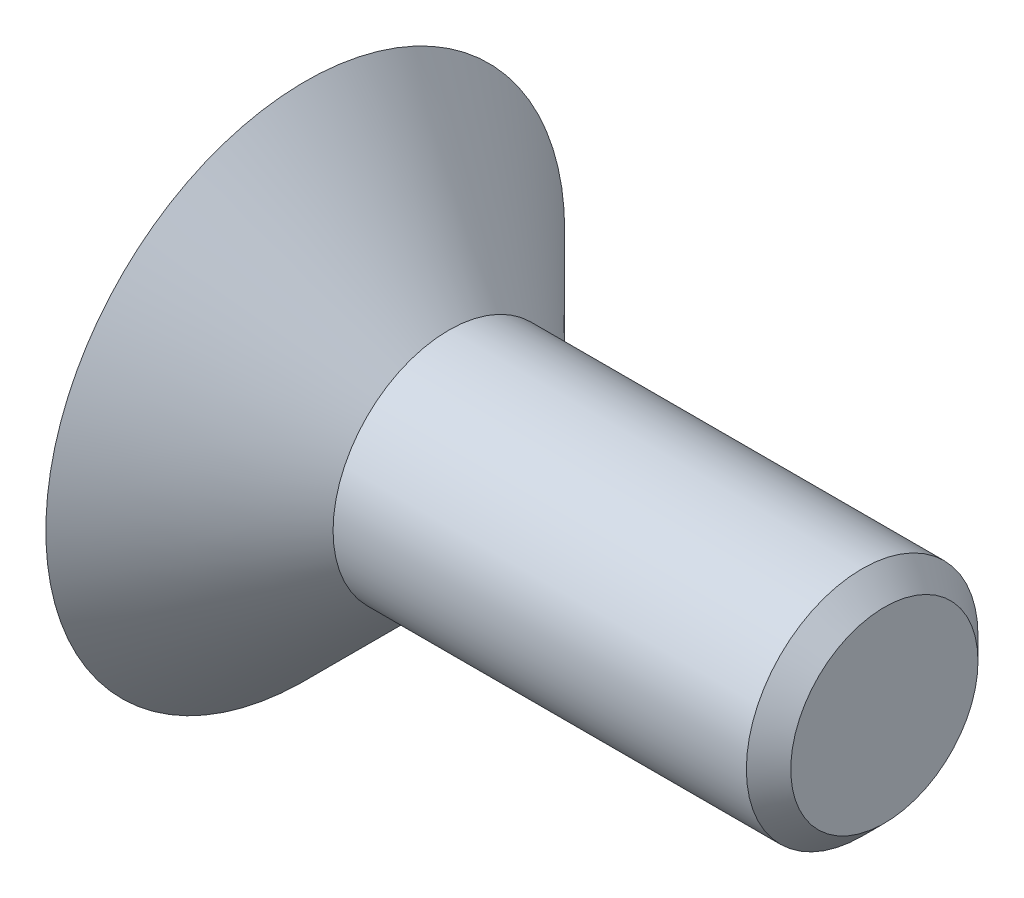
ISO-10303-21;
HEADER;
FILE_DESCRIPTION(('STEP AP214'),'2;1');
FILE_NAME('part.step','',(''),(''),'','','');
FILE_SCHEMA(('AUTOMOTIVE_DESIGN { 1 0 10303 214 1 1 1 1 }'));
ENDSEC;
DATA;
#1=APPLICATION_CONTEXT('core data for automotive mechanical design processes');
#2=APPLICATION_PROTOCOL_DEFINITION('international standard','automotive_design',2000,#1);
#3=PRODUCT_CONTEXT('',#1,'mechanical');
#4=PRODUCT('Part','Part','',(#3));
#5=PRODUCT_RELATED_PRODUCT_CATEGORY('part','',(#4));
#6=PRODUCT_DEFINITION_FORMATION('','',#4);
#7=PRODUCT_DEFINITION_CONTEXT('part definition',#1,'design');
#8=PRODUCT_DEFINITION('design','',#6,#7);
#9=PRODUCT_DEFINITION_SHAPE('','',#8);
#10=(LENGTH_UNIT() NAMED_UNIT(*) SI_UNIT(.MILLI.,.METRE.));
#11=(NAMED_UNIT(*) PLANE_ANGLE_UNIT() SI_UNIT($,.RADIAN.));
#12=(NAMED_UNIT(*) SI_UNIT($,.STERADIAN.) SOLID_ANGLE_UNIT());
#13=UNCERTAINTY_MEASURE_WITH_UNIT(LENGTH_MEASURE(1.E-05),#10,'distance_accuracy_value','');
#14=(GEOMETRIC_REPRESENTATION_CONTEXT(3) GLOBAL_UNCERTAINTY_ASSIGNED_CONTEXT((#13)) GLOBAL_UNIT_ASSIGNED_CONTEXT((#10,
#11,#12)) REPRESENTATION_CONTEXT('',''));
#15=CARTESIAN_POINT('',(0.,0.,0.));
#16=DIRECTION('',(0.,0.,1.));
#17=DIRECTION('',(1.,0.,0.));
#18=AXIS2_PLACEMENT_3D('',#15,#16,#17);
#19=CARTESIAN_POINT('',(-4.96,2.5,0.));
#20=DIRECTION('',(1.,0.,0.));
#21=DIRECTION('',(0.,0.,-1.));
#22=AXIS2_PLACEMENT_3D('',#19,#20,#21);
#23=PLANE('',#22);
#24=CARTESIAN_POINT('',(-4.96,0.,0.));
#25=DIRECTION('',(1.,0.,0.));
#26=DIRECTION('',(0.,0.,-1.));
#27=AXIS2_PLACEMENT_3D('',#24,#25,#26);
#28=CIRCLE('',#27,8.96);
#29=CARTESIAN_POINT('',(-4.96,0.,-8.96));
#30=VERTEX_POINT('',#29);
#31=EDGE_CURVE('E128',#30,#30,#28,.T.);
#32=ORIENTED_EDGE('',*,*,#31,.F.);
#33=EDGE_LOOP('',(#32));
#34=FACE_BOUND('',#33,.T.);
#35=DIRECTION('',(0.,-0.5,0.866025403784439));
#36=VECTOR('',#35,1.);
#37=CARTESIAN_POINT('',(-4.96,-1.5400635094611,-2.33253175473055));
#38=LINE('',#37,#36);
#39=CARTESIAN_POINT('',(-4.96,-1.44337567297406,-2.5));
#40=VERTEX_POINT('',#39);
#41=CARTESIAN_POINT('',(-4.96,-2.88675134594813,0.));
#42=VERTEX_POINT('',#41);
#43=EDGE_CURVE('E11',#40,#42,#38,.T.);
#44=ORIENTED_EDGE('',*,*,#43,.F.);
#45=DIRECTION('',(0.,-1.,0.));
#46=VECTOR('',#45,1.);
#47=CARTESIAN_POINT('',(-4.96,2.5,-2.5));
#48=LINE('',#47,#46);
#49=CARTESIAN_POINT('',(-4.96,1.44337567297406,-2.5));
#50=VERTEX_POINT('',#49);
#51=EDGE_CURVE('E141',#50,#40,#48,.T.);
#52=ORIENTED_EDGE('',*,*,#51,.F.);
#53=DIRECTION('',(0.,-0.5,-0.866025403784439));
#54=VECTOR('',#53,1.);
#55=CARTESIAN_POINT('',(-4.96,2.7900635094611,-0.167468245269451));
#56=LINE('',#55,#54);
#57=CARTESIAN_POINT('',(-4.96,2.88675134594813,0.));
#58=VERTEX_POINT('',#57);
#59=EDGE_CURVE('E137',#58,#50,#56,.T.);
#60=ORIENTED_EDGE('',*,*,#59,.F.);
#61=DIRECTION('',(0.,0.5,-0.866025403784439));
#62=VECTOR('',#61,1.);
#63=CARTESIAN_POINT('',(-4.96,2.7900635094611,0.167468245269452));
#64=LINE('',#63,#62);
#65=CARTESIAN_POINT('',(-4.96,1.44337567297406,2.5));
#66=VERTEX_POINT('',#65);
#67=EDGE_CURVE('E134',#66,#58,#64,.T.);
#68=ORIENTED_EDGE('',*,*,#67,.F.);
#69=DIRECTION('',(0.,1.,0.));
#70=VECTOR('',#69,1.);
#71=CARTESIAN_POINT('',(-4.96,2.5,2.5));
#72=LINE('',#71,#70);
#73=CARTESIAN_POINT('',(-4.96,-1.44337567297406,2.5));
#74=VERTEX_POINT('',#73);
#75=EDGE_CURVE('E139',#74,#66,#72,.T.);
#76=ORIENTED_EDGE('',*,*,#75,.F.);
#77=DIRECTION('',(0.,0.5,0.866025403784439));
#78=VECTOR('',#77,1.);
#79=CARTESIAN_POINT('',(-4.96,-1.5400635094611,2.33253175473055));
#80=LINE('',#79,#78);
#81=EDGE_CURVE('E24',#42,#74,#80,.T.);
#82=ORIENTED_EDGE('',*,*,#81,.F.);
#83=EDGE_LOOP('',(#44,#52,#60,#68,#76,#82));
#84=FACE_BOUND('',#83,.T.);
#85=ADVANCED_FACE('F16',(#34,#84),#23,.F.);
#86=CARTESIAN_POINT('',(-4.96,0.,0.));
#87=DIRECTION('',(-1.,0.,0.));
#88=DIRECTION('',(0.,0.,1.));
#89=AXIS2_PLACEMENT_3D('',#86,#87,#88);
#90=CONICAL_SURFACE('',#89,8.96,0.785398163397448);
#91=CARTESIAN_POINT('',(0.,0.,0.));
#92=DIRECTION('',(1.,0.,0.));
#93=DIRECTION('',(0.,0.,-1.));
#94=AXIS2_PLACEMENT_3D('',#91,#92,#93);
#95=CIRCLE('',#94,4.);
#96=CARTESIAN_POINT('',(0.,0.,-4.));
#97=VERTEX_POINT('',#96);
#98=EDGE_CURVE('E125',#97,#97,#95,.T.);
#99=ORIENTED_EDGE('',*,*,#98,.F.);
#100=EDGE_LOOP('',(#99));
#101=FACE_BOUND('',#100,.T.);
#102=ORIENTED_EDGE('',*,*,#31,.T.);
#103=EDGE_LOOP('',(#102));
#104=FACE_BOUND('',#103,.T.);
#105=ADVANCED_FACE('F213',(#101,#104),#90,.T.);
#106=CARTESIAN_POINT('',(15.04,0.,0.));
#107=DIRECTION('',(1.,0.,0.));
#108=DIRECTION('',(0.,0.,-1.));
#109=AXIS2_PLACEMENT_3D('',#106,#107,#108);
#110=CYLINDRICAL_SURFACE('',#109,4.);
#111=CARTESIAN_POINT('',(14.273,0.,0.));
#112=DIRECTION('',(1.,0.,0.));
#113=DIRECTION('',(0.,0.,-1.));
#114=AXIS2_PLACEMENT_3D('',#111,#112,#113);
#115=CIRCLE('',#114,4.);
#116=CARTESIAN_POINT('',(14.273,0.,-4.));
#117=VERTEX_POINT('',#116);
#118=EDGE_CURVE('E117',#117,#117,#115,.T.);
#119=ORIENTED_EDGE('',*,*,#118,.F.);
#120=EDGE_LOOP('',(#119));
#121=FACE_BOUND('',#120,.T.);
#122=ORIENTED_EDGE('',*,*,#98,.T.);
#123=EDGE_LOOP('',(#122));
#124=FACE_BOUND('',#123,.T.);
#125=ADVANCED_FACE('F218',(#121,#124),#110,.T.);
#126=CARTESIAN_POINT('',(14.273,0.,0.));
#127=DIRECTION('',(-1.,0.,0.));
#128=DIRECTION('',(0.,0.,1.));
#129=AXIS2_PLACEMENT_3D('',#126,#127,#128);
#130=CONICAL_SURFACE('',#129,4.,0.785398163397447);
#131=CARTESIAN_POINT('',(15.04,0.,0.));
#132=DIRECTION('',(1.,0.,0.));
#133=DIRECTION('',(0.,0.,-1.));
#134=AXIS2_PLACEMENT_3D('',#131,#132,#133);
#135=CIRCLE('',#134,3.233);
#136=CARTESIAN_POINT('',(15.04,0.,-3.233));
#137=VERTEX_POINT('',#136);
#138=EDGE_CURVE('E113',#137,#137,#135,.T.);
#139=ORIENTED_EDGE('',*,*,#138,.F.);
#140=EDGE_LOOP('',(#139));
#141=FACE_BOUND('',#140,.T.);
#142=ORIENTED_EDGE('',*,*,#118,.T.);
#143=EDGE_LOOP('',(#142));
#144=FACE_BOUND('',#143,.T.);
#145=ADVANCED_FACE('F225',(#141,#144),#130,.T.);
#146=CARTESIAN_POINT('',(15.04,3.233,0.));
#147=DIRECTION('',(-1.,0.,0.));
#148=DIRECTION('',(0.,0.,1.));
#149=AXIS2_PLACEMENT_3D('',#146,#147,#148);
#150=PLANE('',#149);
#151=ORIENTED_EDGE('',*,*,#138,.T.);
#152=EDGE_LOOP('',(#151));
#153=FACE_BOUND('',#152,.T.);
#154=ADVANCED_FACE('F229',(#153),#150,.F.);
#155=CARTESIAN_POINT('',(-0.669872981077806,0.,0.));
#156=DIRECTION('',(1.,0.,0.));
#157=DIRECTION('',(0.,0.,-1.));
#158=AXIS2_PLACEMENT_3D('',#155,#156,#157);
#159=PLANE('',#158);
#160=DIRECTION('',(0.,1.,0.));
#161=VECTOR('',#160,1.);
#162=CARTESIAN_POINT('',(-0.669872981077806,-1.44337567297406,-2.5));
#163=LINE('',#162,#161);
#164=CARTESIAN_POINT('',(-0.669872981077806,-1.44337567297406,-2.5));
#165=VERTEX_POINT('',#164);
#166=CARTESIAN_POINT('',(-0.669872981077806,0.,-2.5));
#167=VERTEX_POINT('',#166);
#168=EDGE_CURVE('E31',#165,#167,#163,.T.);
#169=ORIENTED_EDGE('',*,*,#168,.F.);
#170=DIRECTION('',(0.,0.5,-0.866025403784439));
#171=VECTOR('',#170,1.);
#172=CARTESIAN_POINT('',(-0.669872981077806,-2.88675134594813,0.));
#173=LINE('',#172,#171);
#174=CARTESIAN_POINT('',(-0.669872981077806,-2.1650635094611,-1.25));
#175=VERTEX_POINT('',#174);
#176=EDGE_CURVE('E107',#175,#165,#173,.T.);
#177=ORIENTED_EDGE('',*,*,#176,.F.);
#178=CARTESIAN_POINT('',(-0.669872981077806,0.,0.));
#179=DIRECTION('',(1.,0.,0.));
#180=DIRECTION('',(0.,0.,-1.));
#181=AXIS2_PLACEMENT_3D('',#178,#179,#180);
#182=CIRCLE('',#181,2.5);
#183=EDGE_CURVE('E186',#175,#167,#182,.T.);
#184=ORIENTED_EDGE('',*,*,#183,.T.);
#185=EDGE_LOOP('',(#169,#177,#184));
#186=FACE_BOUND('',#185,.T.);
#187=ADVANCED_FACE('F189',(#186),#159,.F.);
#188=CARTESIAN_POINT('',(-0.669872981077806,-2.88675134594813,0.));
#189=VERTEX_POINT('',#188);
#190=EDGE_CURVE('E179',#189,#175,#173,.T.);
#191=ORIENTED_EDGE('',*,*,#190,.F.);
#192=DIRECTION('',(0.,-0.5,-0.866025403784439));
#193=VECTOR('',#192,1.);
#194=CARTESIAN_POINT('',(-0.669872981077806,-1.44337567297406,2.5));
#195=LINE('',#194,#193);
#196=CARTESIAN_POINT('',(-0.669872981077806,-2.1650635094611,1.25));
#197=VERTEX_POINT('',#196);
#198=EDGE_CURVE('E108',#197,#189,#195,.T.);
#199=ORIENTED_EDGE('',*,*,#198,.F.);
#200=EDGE_CURVE('E184',#197,#175,#182,.T.);
#201=ORIENTED_EDGE('',*,*,#200,.T.);
#202=EDGE_LOOP('',(#191,#199,#201));
#203=FACE_BOUND('',#202,.T.);
#204=ADVANCED_FACE('F183',(#203),#159,.F.);
#205=CARTESIAN_POINT('',(-0.669872981077806,-1.44337567297406,2.5));
#206=VERTEX_POINT('',#205);
#207=EDGE_CURVE('E101',#206,#197,#195,.T.);
#208=ORIENTED_EDGE('',*,*,#207,.F.);
#209=DIRECTION('',(0.,-1.,0.));
#210=VECTOR('',#209,1.);
#211=CARTESIAN_POINT('',(-0.669872981077806,1.44337567297406,2.5));
#212=LINE('',#211,#210);
#213=CARTESIAN_POINT('',(-0.669872981077806,0.,2.5));
#214=VERTEX_POINT('',#213);
#215=EDGE_CURVE('E88',#214,#206,#212,.T.);
#216=ORIENTED_EDGE('',*,*,#215,.F.);
#217=EDGE_CURVE('E103',#214,#197,#182,.T.);
#218=ORIENTED_EDGE('',*,*,#217,.T.);
#219=EDGE_LOOP('',(#208,#216,#218));
#220=FACE_BOUND('',#219,.T.);
#221=ADVANCED_FACE('F102',(#220),#159,.F.);
#222=CARTESIAN_POINT('',(-0.669872981077806,1.44337567297406,2.5));
#223=VERTEX_POINT('',#222);
#224=EDGE_CURVE('E96',#223,#214,#212,.T.);
#225=ORIENTED_EDGE('',*,*,#224,.F.);
#226=DIRECTION('',(0.,-0.5,0.866025403784439));
#227=VECTOR('',#226,1.);
#228=CARTESIAN_POINT('',(-0.669872981077806,2.88675134594813,0.));
#229=LINE('',#228,#227);
#230=CARTESIAN_POINT('',(-0.669872981077806,2.1650635094611,1.25));
#231=VERTEX_POINT('',#230);
#232=EDGE_CURVE('E165',#231,#223,#229,.T.);
#233=ORIENTED_EDGE('',*,*,#232,.F.);
#234=EDGE_CURVE('E135',#231,#214,#182,.T.);
#235=ORIENTED_EDGE('',*,*,#234,.T.);
#236=EDGE_LOOP('',(#225,#233,#235));
#237=FACE_BOUND('',#236,.T.);
#238=ADVANCED_FACE('F203',(#237),#159,.F.);
#239=CARTESIAN_POINT('',(-0.669872981077806,2.88675134594813,0.));
#240=VERTEX_POINT('',#239);
#241=EDGE_CURVE('E167',#240,#231,#229,.T.);
#242=ORIENTED_EDGE('',*,*,#241,.F.);
#243=DIRECTION('',(0.,0.5,0.866025403784439));
#244=VECTOR('',#243,1.);
#245=CARTESIAN_POINT('',(-0.669872981077806,1.44337567297406,-2.5));
#246=LINE('',#245,#244);
#247=CARTESIAN_POINT('',(-0.669872981077806,2.1650635094611,-1.25));
#248=VERTEX_POINT('',#247);
#249=EDGE_CURVE('E176',#248,#240,#246,.T.);
#250=ORIENTED_EDGE('',*,*,#249,.F.);
#251=EDGE_CURVE('E132',#248,#231,#182,.T.);
#252=ORIENTED_EDGE('',*,*,#251,.T.);
#253=EDGE_LOOP('',(#242,#250,#252));
#254=FACE_BOUND('',#253,.T.);
#255=ADVANCED_FACE('F199',(#254),#159,.F.);
#256=CARTESIAN_POINT('',(-0.669872981077806,1.44337567297406,-2.5));
#257=VERTEX_POINT('',#256);
#258=EDGE_CURVE('E173',#257,#248,#246,.T.);
#259=ORIENTED_EDGE('',*,*,#258,.F.);
#260=EDGE_CURVE('E178',#167,#257,#163,.T.);
#261=ORIENTED_EDGE('',*,*,#260,.F.);
#262=EDGE_CURVE('E131',#167,#248,#182,.T.);
#263=ORIENTED_EDGE('',*,*,#262,.T.);
#264=EDGE_LOOP('',(#259,#261,#263));
#265=FACE_BOUND('',#264,.T.);
#266=ADVANCED_FACE('F196',(#265),#159,.F.);
#267=CARTESIAN_POINT('',(-0.669872981077806,1.44337567297406,2.5));
#268=DIRECTION('',(0.,0.,-1.));
#269=DIRECTION('',(-1.,0.,0.));
#270=AXIS2_PLACEMENT_3D('',#267,#268,#269);
#271=PLANE('',#270);
#272=ORIENTED_EDGE('',*,*,#224,.T.);
#273=ORIENTED_EDGE('',*,*,#215,.T.);
#274=DIRECTION('',(-1.,0.,0.));
#275=VECTOR('',#274,1.);
#276=CARTESIAN_POINT('',(-0.669872981077806,-1.44337567297406,2.5));
#277=LINE('',#276,#275);
#278=EDGE_CURVE('E92',#206,#74,#277,.T.);
#279=ORIENTED_EDGE('',*,*,#278,.T.);
#280=ORIENTED_EDGE('',*,*,#75,.T.);
#281=DIRECTION('',(-1.,0.,0.));
#282=VECTOR('',#281,1.);
#283=CARTESIAN_POINT('',(-0.669872981077806,1.44337567297406,2.5));
#284=LINE('',#283,#282);
#285=EDGE_CURVE('E158',#223,#66,#284,.T.);
#286=ORIENTED_EDGE('',*,*,#285,.F.);
#287=EDGE_LOOP('',(#272,#273,#279,#280,#286));
#288=FACE_BOUND('',#287,.T.);
#289=ADVANCED_FACE('F90',(#288),#271,.T.);
#290=CARTESIAN_POINT('',(-0.669872981077806,-1.44337567297406,2.5));
#291=DIRECTION('',(0.,0.866025403784439,-0.5));
#292=DIRECTION('',(0.,0.5,0.866025403784439));
#293=AXIS2_PLACEMENT_3D('',#290,#291,#292);
#294=PLANE('',#293);
#295=ORIENTED_EDGE('',*,*,#207,.T.);
#296=ORIENTED_EDGE('',*,*,#198,.T.);
#297=DIRECTION('',(-1.,0.,0.));
#298=VECTOR('',#297,1.);
#299=CARTESIAN_POINT('',(-0.669872981077806,-2.88675134594813,0.));
#300=LINE('',#299,#298);
#301=EDGE_CURVE('E114',#189,#42,#300,.T.);
#302=ORIENTED_EDGE('',*,*,#301,.T.);
#303=ORIENTED_EDGE('',*,*,#81,.T.);
#304=ORIENTED_EDGE('',*,*,#278,.F.);
#305=EDGE_LOOP('',(#295,#296,#302,#303,#304));
#306=FACE_BOUND('',#305,.T.);
#307=ADVANCED_FACE('F110',(#306),#294,.T.);
#308=CARTESIAN_POINT('',(-0.669872981077806,-2.88675134594813,0.));
#309=DIRECTION('',(0.,0.866025403784439,0.5));
#310=DIRECTION('',(0.,-0.5,0.866025403784439));
#311=AXIS2_PLACEMENT_3D('',#308,#309,#310);
#312=PLANE('',#311);
#313=ORIENTED_EDGE('',*,*,#190,.T.);
#314=ORIENTED_EDGE('',*,*,#176,.T.);
#315=DIRECTION('',(-1.,0.,0.));
#316=VECTOR('',#315,1.);
#317=CARTESIAN_POINT('',(-0.669872981077806,-1.44337567297406,-2.5));
#318=LINE('',#317,#316);
#319=EDGE_CURVE('E119',#165,#40,#318,.T.);
#320=ORIENTED_EDGE('',*,*,#319,.T.);
#321=ORIENTED_EDGE('',*,*,#43,.T.);
#322=ORIENTED_EDGE('',*,*,#301,.F.);
#323=EDGE_LOOP('',(#313,#314,#320,#321,#322));
#324=FACE_BOUND('',#323,.T.);
#325=ADVANCED_FACE('F153',(#324),#312,.T.);
#326=CARTESIAN_POINT('',(-0.669872981077806,-1.44337567297406,-2.5));
#327=DIRECTION('',(0.,0.,1.));
#328=DIRECTION('',(1.,0.,0.));
#329=AXIS2_PLACEMENT_3D('',#326,#327,#328);
#330=PLANE('',#329);
#331=ORIENTED_EDGE('',*,*,#168,.T.);
#332=ORIENTED_EDGE('',*,*,#260,.T.);
#333=DIRECTION('',(-1.,0.,0.));
#334=VECTOR('',#333,1.);
#335=CARTESIAN_POINT('',(-0.669872981077806,1.44337567297406,-2.5));
#336=LINE('',#335,#334);
#337=EDGE_CURVE('E147',#257,#50,#336,.T.);
#338=ORIENTED_EDGE('',*,*,#337,.T.);
#339=ORIENTED_EDGE('',*,*,#51,.T.);
#340=ORIENTED_EDGE('',*,*,#319,.F.);
#341=EDGE_LOOP('',(#331,#332,#338,#339,#340));
#342=FACE_BOUND('',#341,.T.);
#343=ADVANCED_FACE('F145',(#342),#330,.T.);
#344=CARTESIAN_POINT('',(-0.669872981077806,1.44337567297406,-2.5));
#345=DIRECTION('',(0.,-0.866025403784439,0.5));
#346=DIRECTION('',(0.,-0.5,-0.866025403784439));
#347=AXIS2_PLACEMENT_3D('',#344,#345,#346);
#348=PLANE('',#347);
#349=ORIENTED_EDGE('',*,*,#258,.T.);
#350=ORIENTED_EDGE('',*,*,#249,.T.);
#351=DIRECTION('',(-1.,0.,0.));
#352=VECTOR('',#351,1.);
#353=CARTESIAN_POINT('',(-0.669872981077806,2.88675134594813,0.));
#354=LINE('',#353,#352);
#355=EDGE_CURVE('E166',#240,#58,#354,.T.);
#356=ORIENTED_EDGE('',*,*,#355,.T.);
#357=ORIENTED_EDGE('',*,*,#59,.T.);
#358=ORIENTED_EDGE('',*,*,#337,.F.);
#359=EDGE_LOOP('',(#349,#350,#356,#357,#358));
#360=FACE_BOUND('',#359,.T.);
#361=ADVANCED_FACE('F201',(#360),#348,.T.);
#362=CARTESIAN_POINT('',(-0.669872981077806,2.88675134594813,0.));
#363=DIRECTION('',(0.,-0.866025403784439,-0.5));
#364=DIRECTION('',(0.,0.5,-0.866025403784439));
#365=AXIS2_PLACEMENT_3D('',#362,#363,#364);
#366=PLANE('',#365);
#367=ORIENTED_EDGE('',*,*,#241,.T.);
#368=ORIENTED_EDGE('',*,*,#232,.T.);
#369=ORIENTED_EDGE('',*,*,#285,.T.);
#370=ORIENTED_EDGE('',*,*,#67,.T.);
#371=ORIENTED_EDGE('',*,*,#355,.F.);
#372=EDGE_LOOP('',(#367,#368,#369,#370,#371));
#373=FACE_BOUND('',#372,.T.);
#374=ADVANCED_FACE('F161',(#373),#366,.T.);
#375=CARTESIAN_POINT('',(0.,0.,0.));
#376=DIRECTION('',(-1.,0.,0.));
#377=DIRECTION('',(0.,0.,1.));
#378=AXIS2_PLACEMENT_3D('',#375,#376,#377);
#379=CONICAL_SURFACE('',#378,0.,1.30899693899575);
#380=ORIENTED_EDGE('',*,*,#251,.F.);
#381=ORIENTED_EDGE('',*,*,#262,.F.);
#382=ORIENTED_EDGE('',*,*,#183,.F.);
#383=ORIENTED_EDGE('',*,*,#200,.F.);
#384=ORIENTED_EDGE('',*,*,#217,.F.);
#385=ORIENTED_EDGE('',*,*,#234,.F.);
#386=EDGE_LOOP('',(#380,#381,#382,#383,#384,#385));
#387=FACE_BOUND('',#386,.T.);
#388=CARTESIAN_POINT('',(0.,0.,0.));
#389=VERTEX_POINT('',#388);
#390=VERTEX_LOOP('',#389);
#391=FACE_BOUND('',#390,.T.);
#392=ADVANCED_FACE('F18',(#387,#391),#379,.F.);
#393=CLOSED_SHELL('',(#85,#105,#125,#145,#154,#187,#204,#221,#238,#255,#266,#289,#307,#325,#343,
#361,#374,#392));
#394=MANIFOLD_SOLID_BREP('B1',#393);
#395=ADVANCED_BREP_SHAPE_REPRESENTATION('',(#18,#394),#14);
#396=SHAPE_DEFINITION_REPRESENTATION(#9,#395);
ENDSEC;
END-ISO-10303-21;
